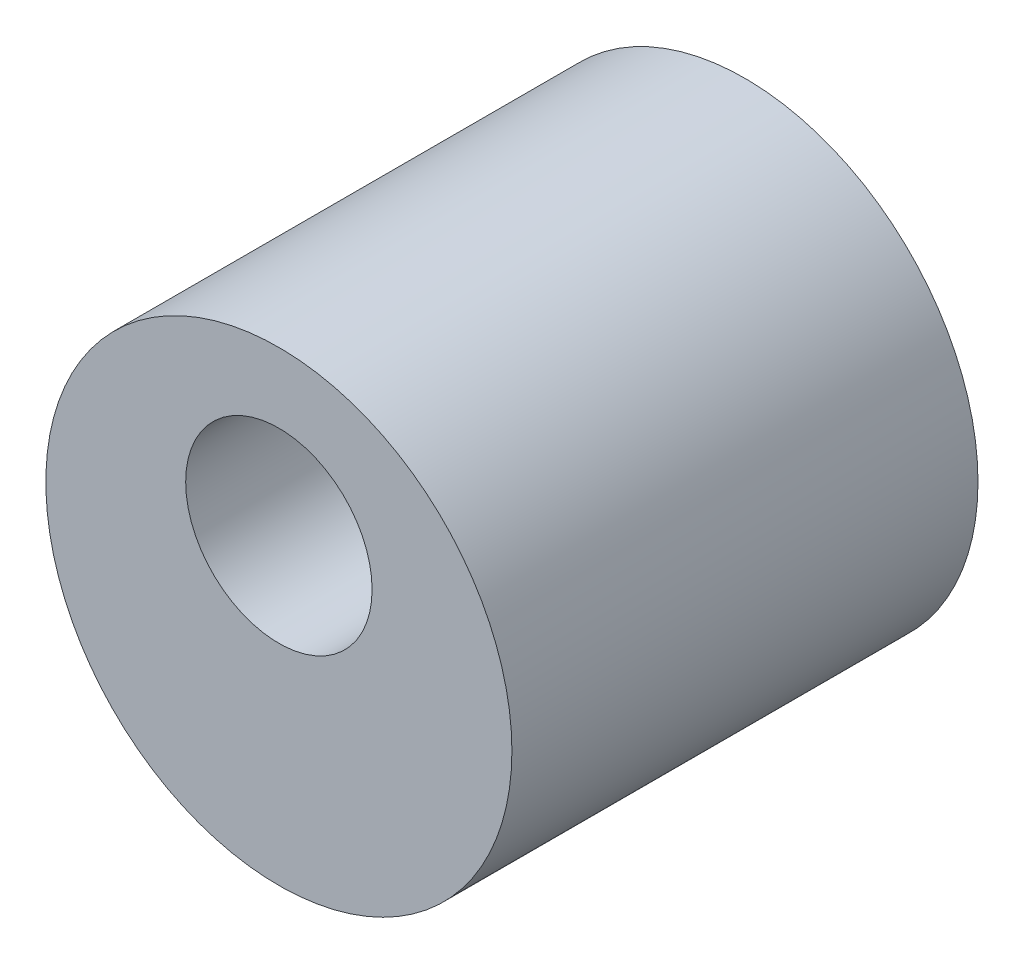
ISO-10303-21;
HEADER;
FILE_DESCRIPTION(('STEP AP214'),'2;1');
FILE_NAME('part.step','',(''),(''),'','','');
FILE_SCHEMA(('AUTOMOTIVE_DESIGN { 1 0 10303 214 1 1 1 1 }'));
ENDSEC;
DATA;
#1=APPLICATION_CONTEXT('core data for automotive mechanical design processes');
#2=APPLICATION_PROTOCOL_DEFINITION('international standard','automotive_design',2000,#1);
#3=PRODUCT_CONTEXT('',#1,'mechanical');
#4=PRODUCT('Part','Part','',(#3));
#5=PRODUCT_RELATED_PRODUCT_CATEGORY('part','',(#4));
#6=PRODUCT_DEFINITION_FORMATION('','',#4);
#7=PRODUCT_DEFINITION_CONTEXT('part definition',#1,'design');
#8=PRODUCT_DEFINITION('design','',#6,#7);
#9=PRODUCT_DEFINITION_SHAPE('','',#8);
#10=(LENGTH_UNIT() NAMED_UNIT(*) SI_UNIT(.MILLI.,.METRE.));
#11=(NAMED_UNIT(*) PLANE_ANGLE_UNIT() SI_UNIT($,.RADIAN.));
#12=(NAMED_UNIT(*) SI_UNIT($,.STERADIAN.) SOLID_ANGLE_UNIT());
#13=UNCERTAINTY_MEASURE_WITH_UNIT(LENGTH_MEASURE(1.E-05),#10,'distance_accuracy_value','');
#14=(GEOMETRIC_REPRESENTATION_CONTEXT(3) GLOBAL_UNCERTAINTY_ASSIGNED_CONTEXT((#13)) GLOBAL_UNIT_ASSIGNED_CONTEXT((#10,
#11,#12)) REPRESENTATION_CONTEXT('',''));
#15=CARTESIAN_POINT('',(0.,0.,0.));
#16=DIRECTION('',(0.,0.,1.));
#17=DIRECTION('',(1.,0.,0.));
#18=AXIS2_PLACEMENT_3D('',#15,#16,#17);
#19=CARTESIAN_POINT('',(0.,0.,5.));
#20=DIRECTION('',(0.,0.,-1.));
#21=DIRECTION('',(-1.,0.,0.));
#22=AXIS2_PLACEMENT_3D('',#19,#20,#21);
#23=CYLINDRICAL_SURFACE('',#22,5.);
#24=CARTESIAN_POINT('',(0.,0.,5.));
#25=DIRECTION('',(0.,0.,1.));
#26=DIRECTION('',(1.,0.,0.));
#27=AXIS2_PLACEMENT_3D('',#24,#25,#26);
#28=CIRCLE('',#27,5.);
#29=CARTESIAN_POINT('',(5.,0.,5.));
#30=VERTEX_POINT('',#29);
#31=EDGE_CURVE('E10',#30,#30,#28,.T.);
#32=ORIENTED_EDGE('',*,*,#31,.F.);
#33=EDGE_LOOP('',(#32));
#34=FACE_BOUND('',#33,.T.);
#35=CARTESIAN_POINT('',(0.,0.,-5.));
#36=DIRECTION('',(0.,0.,1.));
#37=DIRECTION('',(1.,0.,0.));
#38=AXIS2_PLACEMENT_3D('',#35,#36,#37);
#39=CIRCLE('',#38,5.);
#40=CARTESIAN_POINT('',(5.,0.,-5.));
#41=VERTEX_POINT('',#40);
#42=EDGE_CURVE('E44',#41,#41,#39,.T.);
#43=ORIENTED_EDGE('',*,*,#42,.T.);
#44=EDGE_LOOP('',(#43));
#45=FACE_BOUND('',#44,.T.);
#46=ADVANCED_FACE('F45',(#34,#45),#23,.T.);
#47=CARTESIAN_POINT('',(0.,0.,5.));
#48=DIRECTION('',(0.,0.,1.));
#49=DIRECTION('',(1.,0.,0.));
#50=AXIS2_PLACEMENT_3D('',#47,#48,#49);
#51=PLANE('',#50);
#52=CARTESIAN_POINT('',(0.,1.5,5.));
#53=DIRECTION('',(0.,0.,1.));
#54=DIRECTION('',(1.,0.,0.));
#55=AXIS2_PLACEMENT_3D('',#52,#53,#54);
#56=CIRCLE('',#55,2.);
#57=CARTESIAN_POINT('',(2.,1.5,5.));
#58=VERTEX_POINT('',#57);
#59=EDGE_CURVE('E57',#58,#58,#56,.T.);
#60=ORIENTED_EDGE('',*,*,#59,.F.);
#61=EDGE_LOOP('',(#60));
#62=FACE_BOUND('',#61,.T.);
#63=ORIENTED_EDGE('',*,*,#31,.T.);
#64=EDGE_LOOP('',(#63));
#65=FACE_BOUND('',#64,.T.);
#66=ADVANCED_FACE('F73',(#62,#65),#51,.T.);
#67=CARTESIAN_POINT('',(0.,0.,-5.));
#68=DIRECTION('',(0.,0.,1.));
#69=DIRECTION('',(1.,0.,0.));
#70=AXIS2_PLACEMENT_3D('',#67,#68,#69);
#71=PLANE('',#70);
#72=CARTESIAN_POINT('',(0.,1.5,-5.));
#73=DIRECTION('',(0.,0.,1.));
#74=DIRECTION('',(1.,0.,0.));
#75=AXIS2_PLACEMENT_3D('',#72,#73,#74);
#76=CIRCLE('',#75,2.);
#77=CARTESIAN_POINT('',(2.,1.5,-5.));
#78=VERTEX_POINT('',#77);
#79=EDGE_CURVE('E53',#78,#78,#76,.T.);
#80=ORIENTED_EDGE('',*,*,#79,.T.);
#81=EDGE_LOOP('',(#80));
#82=FACE_BOUND('',#81,.T.);
#83=ORIENTED_EDGE('',*,*,#42,.F.);
#84=EDGE_LOOP('',(#83));
#85=FACE_BOUND('',#84,.T.);
#86=ADVANCED_FACE('F64',(#82,#85),#71,.F.);
#87=CARTESIAN_POINT('',(0.,1.5,-5.));
#88=DIRECTION('',(0.,0.,1.));
#89=DIRECTION('',(1.,0.,0.));
#90=AXIS2_PLACEMENT_3D('',#87,#88,#89);
#91=CYLINDRICAL_SURFACE('',#90,2.);
#92=ORIENTED_EDGE('',*,*,#79,.F.);
#93=EDGE_LOOP('',(#92));
#94=FACE_BOUND('',#93,.T.);
#95=ORIENTED_EDGE('',*,*,#59,.T.);
#96=EDGE_LOOP('',(#95));
#97=FACE_BOUND('',#96,.T.);
#98=ADVANCED_FACE('F70',(#94,#97),#91,.F.);
#99=CLOSED_SHELL('',(#46,#66,#86,#98));
#100=MANIFOLD_SOLID_BREP('B2',#99);
#101=ADVANCED_BREP_SHAPE_REPRESENTATION('',(#18,#100),#14);
#102=SHAPE_DEFINITION_REPRESENTATION(#9,#101);
ENDSEC;
END-ISO-10303-21;
